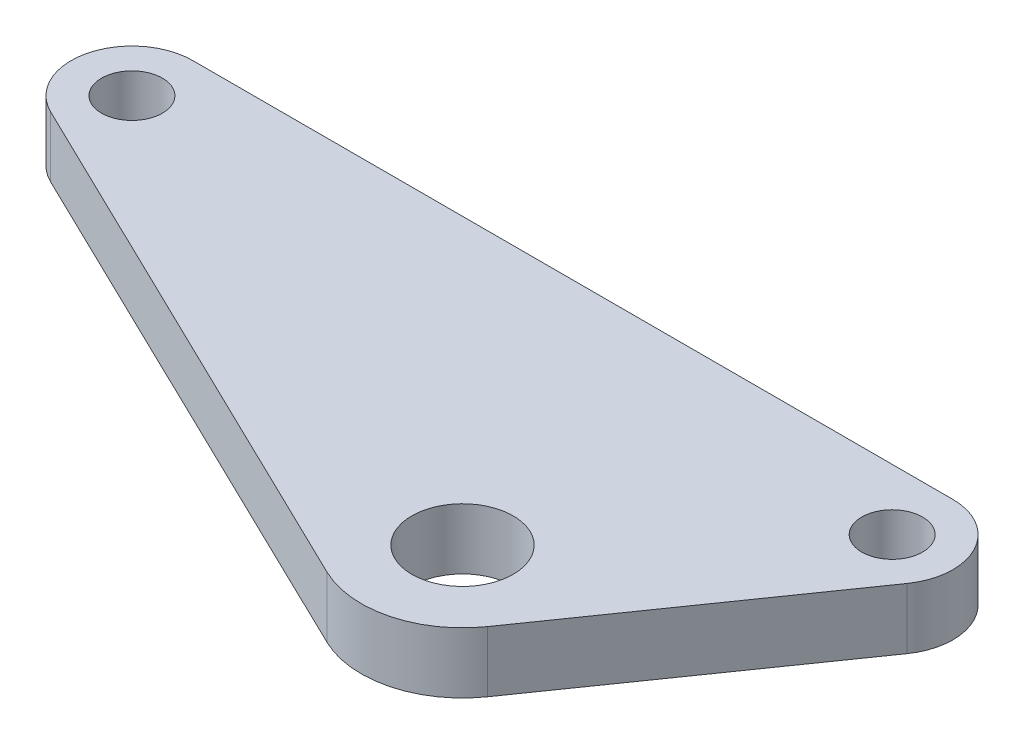
ISO-10303-21;
HEADER;
FILE_DESCRIPTION(('STEP AP214'),'2;1');
FILE_NAME('part.step','',(''),(''),'','','');
FILE_SCHEMA(('AUTOMOTIVE_DESIGN { 1 0 10303 214 1 1 1 1 }'));
ENDSEC;
DATA;
#1=APPLICATION_CONTEXT('core data for automotive mechanical design processes');
#2=APPLICATION_PROTOCOL_DEFINITION('international standard','automotive_design',2000,#1);
#3=PRODUCT_CONTEXT('',#1,'mechanical');
#4=PRODUCT('Part','Part','',(#3));
#5=PRODUCT_RELATED_PRODUCT_CATEGORY('part','',(#4));
#6=PRODUCT_DEFINITION_FORMATION('','',#4);
#7=PRODUCT_DEFINITION_CONTEXT('part definition',#1,'design');
#8=PRODUCT_DEFINITION('design','',#6,#7);
#9=PRODUCT_DEFINITION_SHAPE('','',#8);
#10=(LENGTH_UNIT() NAMED_UNIT(*) SI_UNIT(.MILLI.,.METRE.));
#11=(NAMED_UNIT(*) PLANE_ANGLE_UNIT() SI_UNIT($,.RADIAN.));
#12=(NAMED_UNIT(*) SI_UNIT($,.STERADIAN.) SOLID_ANGLE_UNIT());
#13=UNCERTAINTY_MEASURE_WITH_UNIT(LENGTH_MEASURE(1.E-05),#10,'distance_accuracy_value','');
#14=(GEOMETRIC_REPRESENTATION_CONTEXT(3) GLOBAL_UNCERTAINTY_ASSIGNED_CONTEXT((#13)) GLOBAL_UNIT_ASSIGNED_CONTEXT((#10,
#11,#12)) REPRESENTATION_CONTEXT('',''));
#15=CARTESIAN_POINT('',(0.,0.,0.));
#16=DIRECTION('',(0.,0.,1.));
#17=DIRECTION('',(1.,0.,0.));
#18=AXIS2_PLACEMENT_3D('',#15,#16,#17);
#19=CARTESIAN_POINT('',(0.,3.,0.));
#20=DIRECTION('',(0.,1.,0.));
#21=DIRECTION('',(0.,0.,1.));
#22=AXIS2_PLACEMENT_3D('',#19,#20,#21);
#23=PLANE('',#22);
#24=CARTESIAN_POINT('',(75.,3.,0.));
#25=DIRECTION('',(0.,1.,0.));
#26=DIRECTION('',(0.,0.,1.));
#27=AXIS2_PLACEMENT_3D('',#24,#25,#26);
#28=CIRCLE('',#27,3.00000000000001);
#29=CARTESIAN_POINT('',(75.,3.,3.00000000000001));
#30=VERTEX_POINT('',#29);
#31=EDGE_CURVE('E192',#30,#30,#28,.T.);
#32=ORIENTED_EDGE('',*,*,#31,.F.);
#33=EDGE_LOOP('',(#32));
#34=FACE_BOUND('',#33,.T.);
#35=CARTESIAN_POINT('',(0.,3.,0.));
#36=DIRECTION('',(0.,1.,0.));
#37=DIRECTION('',(0.,0.,1.));
#38=AXIS2_PLACEMENT_3D('',#35,#36,#37);
#39=CIRCLE('',#38,6.);
#40=CARTESIAN_POINT('',(0.,3.,-6.));
#41=VERTEX_POINT('',#40);
#42=CARTESIAN_POINT('',(-2.61893896713588,3.,5.3982551520299));
#43=VERTEX_POINT('',#42);
#44=EDGE_CURVE('E137',#41,#43,#39,.T.);
#45=ORIENTED_EDGE('',*,*,#44,.T.);
#46=DIRECTION('',(0.899709192004982,0.,0.436489827855979));
#47=VECTOR('',#46,1.);
#48=CARTESIAN_POINT('',(-2.61893896713588,3.,5.3982551520299));
#49=LINE('',#48,#47);
#50=CARTESIAN_POINT('',(50.3417683881069,3.,31.0919017681165));
#51=VERTEX_POINT('',#50);
#52=EDGE_CURVE('E95',#43,#51,#49,.T.);
#53=ORIENTED_EDGE('',*,*,#52,.T.);
#54=CARTESIAN_POINT('',(54.7066666666667,3.,22.0948098480666));
#55=DIRECTION('',(0.,1.,0.));
#56=DIRECTION('',(0.,0.,1.));
#57=AXIS2_PLACEMENT_3D('',#54,#55,#56);
#58=CIRCLE('',#57,10.);
#59=CARTESIAN_POINT('',(62.9077695294879,3.,27.8168647091655));
#60=VERTEX_POINT('',#59);
#61=EDGE_CURVE('E108',#51,#60,#58,.T.);
#62=ORIENTED_EDGE('',*,*,#61,.T.);
#63=DIRECTION('',(0.572205486109889,0.,-0.820110286282123));
#64=VECTOR('',#63,1.);
#65=CARTESIAN_POINT('',(62.9077695294879,3.,27.8168647091655));
#66=LINE('',#65,#64);
#67=CARTESIAN_POINT('',(79.9206617176927,3.,3.43323291665934));
#68=VERTEX_POINT('',#67);
#69=EDGE_CURVE('E102',#60,#68,#66,.T.);
#70=ORIENTED_EDGE('',*,*,#69,.T.);
#71=CARTESIAN_POINT('',(75.,3.,0.));
#72=DIRECTION('',(0.,1.,0.));
#73=DIRECTION('',(0.,0.,1.));
#74=AXIS2_PLACEMENT_3D('',#71,#72,#73);
#75=CIRCLE('',#74,6.00000000000001);
#76=CARTESIAN_POINT('',(75.,3.,-6.00000000000001));
#77=VERTEX_POINT('',#76);
#78=EDGE_CURVE('E106',#68,#77,#75,.T.);
#79=ORIENTED_EDGE('',*,*,#78,.T.);
#80=DIRECTION('',(-1.,0.,0.));
#81=VECTOR('',#80,1.);
#82=CARTESIAN_POINT('',(0.,3.,-6.));
#83=LINE('',#82,#81);
#84=EDGE_CURVE('E58',#77,#41,#83,.T.);
#85=ORIENTED_EDGE('',*,*,#84,.T.);
#86=EDGE_LOOP('',(#45,#53,#62,#70,#79,#85));
#87=FACE_BOUND('',#86,.T.);
#88=CARTESIAN_POINT('',(54.7066666666667,3.,22.0948098480666));
#89=DIRECTION('',(0.,1.,0.));
#90=DIRECTION('',(0.,0.,1.));
#91=AXIS2_PLACEMENT_3D('',#88,#89,#90);
#92=CIRCLE('',#91,5.);
#93=CARTESIAN_POINT('',(54.7066666666667,3.,27.0948098480666));
#94=VERTEX_POINT('',#93);
#95=EDGE_CURVE('E130',#94,#94,#92,.T.);
#96=ORIENTED_EDGE('',*,*,#95,.F.);
#97=EDGE_LOOP('',(#96));
#98=FACE_BOUND('',#97,.T.);
#99=CARTESIAN_POINT('',(0.,3.,0.));
#100=DIRECTION('',(0.,1.,0.));
#101=DIRECTION('',(0.,0.,1.));
#102=AXIS2_PLACEMENT_3D('',#99,#100,#101);
#103=CIRCLE('',#102,3.);
#104=CARTESIAN_POINT('',(0.,3.,3.));
#105=VERTEX_POINT('',#104);
#106=EDGE_CURVE('E183',#105,#105,#103,.T.);
#107=ORIENTED_EDGE('',*,*,#106,.F.);
#108=EDGE_LOOP('',(#107));
#109=FACE_BOUND('',#108,.T.);
#110=ADVANCED_FACE('F41',(#34,#87,#98,#109),#23,.T.);
#111=CARTESIAN_POINT('',(0.,-3.,0.));
#112=DIRECTION('',(0.,1.,0.));
#113=DIRECTION('',(0.,0.,1.));
#114=AXIS2_PLACEMENT_3D('',#111,#112,#113);
#115=PLANE('',#114);
#116=CARTESIAN_POINT('',(0.,-3.,0.));
#117=DIRECTION('',(0.,1.,0.));
#118=DIRECTION('',(0.,0.,1.));
#119=AXIS2_PLACEMENT_3D('',#116,#117,#118);
#120=CIRCLE('',#119,6.);
#121=CARTESIAN_POINT('',(0.,-3.,-6.));
#122=VERTEX_POINT('',#121);
#123=CARTESIAN_POINT('',(-2.61893896713588,-3.,5.3982551520299));
#124=VERTEX_POINT('',#123);
#125=EDGE_CURVE('E126',#122,#124,#120,.T.);
#126=ORIENTED_EDGE('',*,*,#125,.F.);
#127=DIRECTION('',(-1.,0.,0.));
#128=VECTOR('',#127,1.);
#129=CARTESIAN_POINT('',(0.,-3.,-6.));
#130=LINE('',#129,#128);
#131=CARTESIAN_POINT('',(75.,-3.,-6.00000000000001));
#132=VERTEX_POINT('',#131);
#133=EDGE_CURVE('E87',#132,#122,#130,.T.);
#134=ORIENTED_EDGE('',*,*,#133,.F.);
#135=CARTESIAN_POINT('',(75.,-3.,0.));
#136=DIRECTION('',(0.,1.,0.));
#137=DIRECTION('',(0.,0.,1.));
#138=AXIS2_PLACEMENT_3D('',#135,#136,#137);
#139=CIRCLE('',#138,6.00000000000001);
#140=CARTESIAN_POINT('',(79.9206617176927,-3.,3.43323291665934));
#141=VERTEX_POINT('',#140);
#142=EDGE_CURVE('E81',#141,#132,#139,.T.);
#143=ORIENTED_EDGE('',*,*,#142,.F.);
#144=DIRECTION('',(0.572205486109889,0.,-0.820110286282123));
#145=VECTOR('',#144,1.);
#146=CARTESIAN_POINT('',(62.9077695294879,-3.,27.8168647091655));
#147=LINE('',#146,#145);
#148=CARTESIAN_POINT('',(62.9077695294879,-3.,27.8168647091655));
#149=VERTEX_POINT('',#148);
#150=EDGE_CURVE('E116',#149,#141,#147,.T.);
#151=ORIENTED_EDGE('',*,*,#150,.F.);
#152=CARTESIAN_POINT('',(54.7066666666667,-3.,22.0948098480666));
#153=DIRECTION('',(0.,1.,0.));
#154=DIRECTION('',(0.,0.,1.));
#155=AXIS2_PLACEMENT_3D('',#152,#153,#154);
#156=CIRCLE('',#155,10.);
#157=CARTESIAN_POINT('',(50.3417683881069,-3.,31.0919017681165));
#158=VERTEX_POINT('',#157);
#159=EDGE_CURVE('E132',#158,#149,#156,.T.);
#160=ORIENTED_EDGE('',*,*,#159,.F.);
#161=DIRECTION('',(0.899709192004982,0.,0.436489827855979));
#162=VECTOR('',#161,1.);
#163=CARTESIAN_POINT('',(-2.61893896713588,-3.,5.3982551520299));
#164=LINE('',#163,#162);
#165=EDGE_CURVE('E129',#124,#158,#164,.T.);
#166=ORIENTED_EDGE('',*,*,#165,.F.);
#167=EDGE_LOOP('',(#126,#134,#143,#151,#160,#166));
#168=FACE_BOUND('',#167,.T.);
#169=CARTESIAN_POINT('',(54.7066666666667,-3.,22.0948098480666));
#170=DIRECTION('',(0.,1.,0.));
#171=DIRECTION('',(0.,0.,1.));
#172=AXIS2_PLACEMENT_3D('',#169,#170,#171);
#173=CIRCLE('',#172,5.);
#174=CARTESIAN_POINT('',(54.7066666666667,-3.,27.0948098480666));
#175=VERTEX_POINT('',#174);
#176=EDGE_CURVE('E195',#175,#175,#173,.T.);
#177=ORIENTED_EDGE('',*,*,#176,.T.);
#178=EDGE_LOOP('',(#177));
#179=FACE_BOUND('',#178,.T.);
#180=CARTESIAN_POINT('',(75.,-3.,0.));
#181=DIRECTION('',(0.,1.,0.));
#182=DIRECTION('',(0.,0.,1.));
#183=AXIS2_PLACEMENT_3D('',#180,#181,#182);
#184=CIRCLE('',#183,3.00000000000001);
#185=CARTESIAN_POINT('',(75.,-3.,3.00000000000001));
#186=VERTEX_POINT('',#185);
#187=EDGE_CURVE('E189',#186,#186,#184,.T.);
#188=ORIENTED_EDGE('',*,*,#187,.T.);
#189=EDGE_LOOP('',(#188));
#190=FACE_BOUND('',#189,.T.);
#191=CARTESIAN_POINT('',(0.,-3.,0.));
#192=DIRECTION('',(0.,1.,0.));
#193=DIRECTION('',(0.,0.,1.));
#194=AXIS2_PLACEMENT_3D('',#191,#192,#193);
#195=CIRCLE('',#194,3.);
#196=CARTESIAN_POINT('',(0.,-3.,3.));
#197=VERTEX_POINT('',#196);
#198=EDGE_CURVE('E186',#197,#197,#195,.T.);
#199=ORIENTED_EDGE('',*,*,#198,.T.);
#200=EDGE_LOOP('',(#199));
#201=FACE_BOUND('',#200,.T.);
#202=ADVANCED_FACE('F146',(#168,#179,#190,#201),#115,.F.);
#203=CARTESIAN_POINT('',(0.,3.,0.));
#204=DIRECTION('',(0.,-1.,0.));
#205=DIRECTION('',(0.,0.,-1.));
#206=AXIS2_PLACEMENT_3D('',#203,#204,#205);
#207=CYLINDRICAL_SURFACE('',#206,6.);
#208=ORIENTED_EDGE('',*,*,#125,.T.);
#209=DIRECTION('',(0.,-1.,0.));
#210=VECTOR('',#209,1.);
#211=CARTESIAN_POINT('',(-2.61893896713588,3.,5.3982551520299));
#212=LINE('',#211,#210);
#213=EDGE_CURVE('E11',#43,#124,#212,.T.);
#214=ORIENTED_EDGE('',*,*,#213,.F.);
#215=ORIENTED_EDGE('',*,*,#44,.F.);
#216=DIRECTION('',(0.,-1.,0.));
#217=VECTOR('',#216,1.);
#218=CARTESIAN_POINT('',(0.,3.,-6.));
#219=LINE('',#218,#217);
#220=EDGE_CURVE('E122',#41,#122,#219,.T.);
#221=ORIENTED_EDGE('',*,*,#220,.T.);
#222=EDGE_LOOP('',(#208,#214,#215,#221));
#223=FACE_BOUND('',#222,.T.);
#224=ADVANCED_FACE('F43',(#223),#207,.T.);
#225=CARTESIAN_POINT('',(-2.61893896713588,3.,5.3982551520299));
#226=DIRECTION('',(0.436489827855979,0.,-0.899709192004982));
#227=DIRECTION('',(-0.899709192004982,0.,-0.436489827855979));
#228=AXIS2_PLACEMENT_3D('',#225,#226,#227);
#229=PLANE('',#228);
#230=ORIENTED_EDGE('',*,*,#165,.T.);
#231=DIRECTION('',(0.,-1.,0.));
#232=VECTOR('',#231,1.);
#233=CARTESIAN_POINT('',(50.3417683881069,3.,31.0919017681165));
#234=LINE('',#233,#232);
#235=EDGE_CURVE('E50',#51,#158,#234,.T.);
#236=ORIENTED_EDGE('',*,*,#235,.F.);
#237=ORIENTED_EDGE('',*,*,#52,.F.);
#238=ORIENTED_EDGE('',*,*,#213,.T.);
#239=EDGE_LOOP('',(#230,#236,#237,#238));
#240=FACE_BOUND('',#239,.T.);
#241=ADVANCED_FACE('F248',(#240),#229,.F.);
#242=CARTESIAN_POINT('',(54.7066666666667,3.,22.0948098480666));
#243=DIRECTION('',(0.,-1.,0.));
#244=DIRECTION('',(0.,0.,-1.));
#245=AXIS2_PLACEMENT_3D('',#242,#243,#244);
#246=CYLINDRICAL_SURFACE('',#245,10.);
#247=ORIENTED_EDGE('',*,*,#159,.T.);
#248=DIRECTION('',(0.,-1.,0.));
#249=VECTOR('',#248,1.);
#250=CARTESIAN_POINT('',(62.9077695294879,3.,27.8168647091655));
#251=LINE('',#250,#249);
#252=EDGE_CURVE('E117',#60,#149,#251,.T.);
#253=ORIENTED_EDGE('',*,*,#252,.F.);
#254=ORIENTED_EDGE('',*,*,#61,.F.);
#255=ORIENTED_EDGE('',*,*,#235,.T.);
#256=EDGE_LOOP('',(#247,#253,#254,#255));
#257=FACE_BOUND('',#256,.T.);
#258=ADVANCED_FACE('F143',(#257),#246,.T.);
#259=CARTESIAN_POINT('',(62.9077695294879,3.,27.8168647091655));
#260=DIRECTION('',(-0.820110286282123,0.,-0.572205486109889));
#261=DIRECTION('',(-0.57220548610989,0.,0.820110286282123));
#262=AXIS2_PLACEMENT_3D('',#259,#260,#261);
#263=PLANE('',#262);
#264=ORIENTED_EDGE('',*,*,#150,.T.);
#265=DIRECTION('',(0.,-1.,0.));
#266=VECTOR('',#265,1.);
#267=CARTESIAN_POINT('',(79.9206617176927,3.,3.43323291665934));
#268=LINE('',#267,#266);
#269=EDGE_CURVE('E113',#68,#141,#268,.T.);
#270=ORIENTED_EDGE('',*,*,#269,.F.);
#271=ORIENTED_EDGE('',*,*,#69,.F.);
#272=ORIENTED_EDGE('',*,*,#252,.T.);
#273=EDGE_LOOP('',(#264,#270,#271,#272));
#274=FACE_BOUND('',#273,.T.);
#275=ADVANCED_FACE('F114',(#274),#263,.F.);
#276=CARTESIAN_POINT('',(75.,3.,0.));
#277=DIRECTION('',(0.,-1.,0.));
#278=DIRECTION('',(0.,0.,-1.));
#279=AXIS2_PLACEMENT_3D('',#276,#277,#278);
#280=CYLINDRICAL_SURFACE('',#279,6.00000000000001);
#281=ORIENTED_EDGE('',*,*,#142,.T.);
#282=DIRECTION('',(0.,-1.,0.));
#283=VECTOR('',#282,1.);
#284=CARTESIAN_POINT('',(75.,3.,-6.00000000000001));
#285=LINE('',#284,#283);
#286=EDGE_CURVE('E118',#77,#132,#285,.T.);
#287=ORIENTED_EDGE('',*,*,#286,.F.);
#288=ORIENTED_EDGE('',*,*,#78,.F.);
#289=ORIENTED_EDGE('',*,*,#269,.T.);
#290=EDGE_LOOP('',(#281,#287,#288,#289));
#291=FACE_BOUND('',#290,.T.);
#292=ADVANCED_FACE('F120',(#291),#280,.T.);
#293=CARTESIAN_POINT('',(0.,3.,-6.));
#294=DIRECTION('',(0.,0.,1.));
#295=DIRECTION('',(1.,0.,0.));
#296=AXIS2_PLACEMENT_3D('',#293,#294,#295);
#297=PLANE('',#296);
#298=ORIENTED_EDGE('',*,*,#133,.T.);
#299=ORIENTED_EDGE('',*,*,#220,.F.);
#300=ORIENTED_EDGE('',*,*,#84,.F.);
#301=ORIENTED_EDGE('',*,*,#286,.T.);
#302=EDGE_LOOP('',(#298,#299,#300,#301));
#303=FACE_BOUND('',#302,.T.);
#304=ADVANCED_FACE('F151',(#303),#297,.F.);
#305=CARTESIAN_POINT('',(54.7066666666667,3.,22.0948098480666));
#306=DIRECTION('',(0.,-1.,0.));
#307=DIRECTION('',(0.,0.,-1.));
#308=AXIS2_PLACEMENT_3D('',#305,#306,#307);
#309=CYLINDRICAL_SURFACE('',#308,5.);
#310=ORIENTED_EDGE('',*,*,#95,.T.);
#311=EDGE_LOOP('',(#310));
#312=FACE_BOUND('',#311,.T.);
#313=ORIENTED_EDGE('',*,*,#176,.F.);
#314=EDGE_LOOP('',(#313));
#315=FACE_BOUND('',#314,.T.);
#316=ADVANCED_FACE('F153',(#312,#315),#309,.F.);
#317=CARTESIAN_POINT('',(75.,3.,0.));
#318=DIRECTION('',(0.,-1.,0.));
#319=DIRECTION('',(0.,0.,-1.));
#320=AXIS2_PLACEMENT_3D('',#317,#318,#319);
#321=CYLINDRICAL_SURFACE('',#320,3.00000000000001);
#322=ORIENTED_EDGE('',*,*,#31,.T.);
#323=EDGE_LOOP('',(#322));
#324=FACE_BOUND('',#323,.T.);
#325=ORIENTED_EDGE('',*,*,#187,.F.);
#326=EDGE_LOOP('',(#325));
#327=FACE_BOUND('',#326,.T.);
#328=ADVANCED_FACE('F159',(#324,#327),#321,.F.);
#329=CARTESIAN_POINT('',(0.,3.,0.));
#330=DIRECTION('',(0.,-1.,0.));
#331=DIRECTION('',(0.,0.,-1.));
#332=AXIS2_PLACEMENT_3D('',#329,#330,#331);
#333=CYLINDRICAL_SURFACE('',#332,3.);
#334=ORIENTED_EDGE('',*,*,#106,.T.);
#335=EDGE_LOOP('',(#334));
#336=FACE_BOUND('',#335,.T.);
#337=ORIENTED_EDGE('',*,*,#198,.F.);
#338=EDGE_LOOP('',(#337));
#339=FACE_BOUND('',#338,.T.);
#340=ADVANCED_FACE('F174',(#336,#339),#333,.F.);
#341=CLOSED_SHELL('',(#110,#202,#224,#241,#258,#275,#292,#304,#316,#328,#340));
#342=MANIFOLD_SOLID_BREP('B2',#341);
#343=ADVANCED_BREP_SHAPE_REPRESENTATION('',(#18,#342),#14);
#344=SHAPE_DEFINITION_REPRESENTATION(#9,#343);
ENDSEC;
END-ISO-10303-21;
